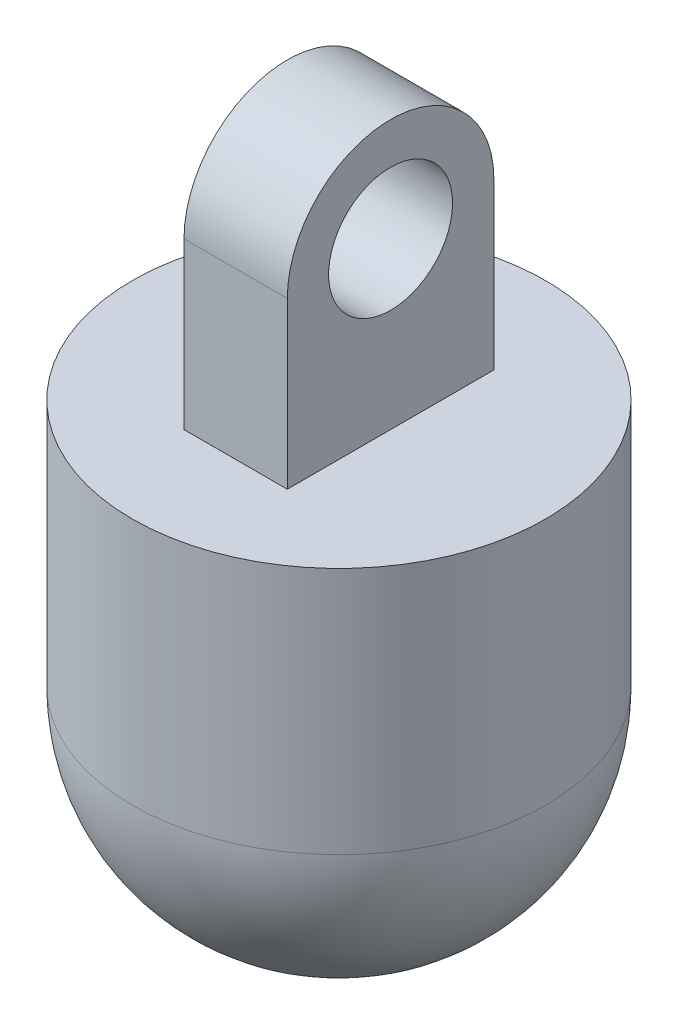
ISO-10303-21;
HEADER;
FILE_DESCRIPTION(('STEP AP214'),'2;1');
FILE_NAME('part.step','',(''),(''),'','','');
FILE_SCHEMA(('AUTOMOTIVE_DESIGN { 1 0 10303 214 1 1 1 1 }'));
ENDSEC;
DATA;
#1=APPLICATION_CONTEXT('core data for automotive mechanical design processes');
#2=APPLICATION_PROTOCOL_DEFINITION('international standard','automotive_design',2000,#1);
#3=PRODUCT_CONTEXT('',#1,'mechanical');
#4=PRODUCT('Part','Part','',(#3));
#5=PRODUCT_RELATED_PRODUCT_CATEGORY('part','',(#4));
#6=PRODUCT_DEFINITION_FORMATION('','',#4);
#7=PRODUCT_DEFINITION_CONTEXT('part definition',#1,'design');
#8=PRODUCT_DEFINITION('design','',#6,#7);
#9=PRODUCT_DEFINITION_SHAPE('','',#8);
#10=(LENGTH_UNIT() NAMED_UNIT(*) SI_UNIT(.MILLI.,.METRE.));
#11=(NAMED_UNIT(*) PLANE_ANGLE_UNIT() SI_UNIT($,.RADIAN.));
#12=(NAMED_UNIT(*) SI_UNIT($,.STERADIAN.) SOLID_ANGLE_UNIT());
#13=UNCERTAINTY_MEASURE_WITH_UNIT(LENGTH_MEASURE(1.E-05),#10,'distance_accuracy_value','');
#14=(GEOMETRIC_REPRESENTATION_CONTEXT(3) GLOBAL_UNCERTAINTY_ASSIGNED_CONTEXT((#13)) GLOBAL_UNIT_ASSIGNED_CONTEXT((#10,
#11,#12)) REPRESENTATION_CONTEXT('',''));
#15=CARTESIAN_POINT('',(0.,0.,0.));
#16=DIRECTION('',(0.,0.,1.));
#17=DIRECTION('',(1.,0.,0.));
#18=AXIS2_PLACEMENT_3D('',#15,#16,#17);
#19=CARTESIAN_POINT('',(0.,60.,0.));
#20=DIRECTION('',(0.,1.,0.));
#21=DIRECTION('',(0.,0.,1.));
#22=AXIS2_PLACEMENT_3D('',#19,#20,#21);
#23=PLANE('',#22);
#24=CARTESIAN_POINT('',(0.,60.,0.));
#25=DIRECTION('',(0.,1.,0.));
#26=DIRECTION('',(0.,0.,1.));
#27=AXIS2_PLACEMENT_3D('',#24,#25,#26);
#28=CIRCLE('',#27,50.);
#29=CARTESIAN_POINT('',(0.,60.,50.));
#30=VERTEX_POINT('',#29);
#31=EDGE_CURVE('E11',#30,#30,#28,.T.);
#32=ORIENTED_EDGE('',*,*,#31,.T.);
#33=EDGE_LOOP('',(#32));
#34=FACE_BOUND('',#33,.T.);
#35=DIRECTION('',(0.,0.,-1.));
#36=VECTOR('',#35,1.);
#37=CARTESIAN_POINT('',(12.5,60.,25.));
#38=LINE('',#37,#36);
#39=CARTESIAN_POINT('',(12.5,60.,25.));
#40=VERTEX_POINT('',#39);
#41=CARTESIAN_POINT('',(12.5,60.,-25.));
#42=VERTEX_POINT('',#41);
#43=EDGE_CURVE('E85',#40,#42,#38,.T.);
#44=ORIENTED_EDGE('',*,*,#43,.F.);
#45=DIRECTION('',(-1.,0.,0.));
#46=VECTOR('',#45,1.);
#47=CARTESIAN_POINT('',(12.5,60.,25.));
#48=LINE('',#47,#46);
#49=CARTESIAN_POINT('',(-12.5,60.,25.));
#50=VERTEX_POINT('',#49);
#51=EDGE_CURVE('E83',#40,#50,#48,.T.);
#52=ORIENTED_EDGE('',*,*,#51,.T.);
#53=DIRECTION('',(0.,0.,-1.));
#54=VECTOR('',#53,1.);
#55=CARTESIAN_POINT('',(-12.5,60.,25.));
#56=LINE('',#55,#54);
#57=CARTESIAN_POINT('',(-12.5,60.,-25.));
#58=VERTEX_POINT('',#57);
#59=EDGE_CURVE('E105',#50,#58,#56,.T.);
#60=ORIENTED_EDGE('',*,*,#59,.T.);
#61=DIRECTION('',(-1.,0.,0.));
#62=VECTOR('',#61,1.);
#63=CARTESIAN_POINT('',(12.5,60.,-25.));
#64=LINE('',#63,#62);
#65=EDGE_CURVE('E98',#42,#58,#64,.T.);
#66=ORIENTED_EDGE('',*,*,#65,.F.);
#67=EDGE_LOOP('',(#44,#52,#60,#66));
#68=FACE_BOUND('',#67,.T.);
#69=ADVANCED_FACE('F35',(#34,#68),#23,.T.);
#70=CARTESIAN_POINT('',(0.,60.,0.));
#71=DIRECTION('',(0.,-1.,0.));
#72=DIRECTION('',(0.,0.,-1.));
#73=AXIS2_PLACEMENT_3D('',#70,#71,#72);
#74=CYLINDRICAL_SURFACE('',#73,50.);
#75=ORIENTED_EDGE('',*,*,#31,.F.);
#76=EDGE_LOOP('',(#75));
#77=FACE_BOUND('',#76,.T.);
#78=CARTESIAN_POINT('',(0.,0.,0.));
#79=DIRECTION('',(0.,1.,0.));
#80=DIRECTION('',(0.,0.,1.));
#81=AXIS2_PLACEMENT_3D('',#78,#79,#80);
#82=CIRCLE('',#81,50.);
#83=CARTESIAN_POINT('',(0.,0.,50.));
#84=VERTEX_POINT('',#83);
#85=EDGE_CURVE('E39',#84,#84,#82,.T.);
#86=ORIENTED_EDGE('',*,*,#85,.T.);
#87=EDGE_LOOP('',(#86));
#88=FACE_BOUND('',#87,.T.);
#89=ADVANCED_FACE('F131',(#77,#88),#74,.T.);
#90=CARTESIAN_POINT('',(0.,0.,0.));
#91=DIRECTION('',(0.,0.,1.));
#92=DIRECTION('',(1.,0.,0.));
#93=AXIS2_PLACEMENT_3D('',#90,#91,#92);
#94=SPHERICAL_SURFACE('',#93,50.);
#95=CARTESIAN_POINT('',(0.,0.,0.));
#96=DIRECTION('',(0.,1.,0.));
#97=DIRECTION('',(0.,0.,1.));
#98=AXIS2_PLACEMENT_3D('',#95,#96,#97);
#99=SPHERICAL_SURFACE('',#98,50.);
#100=ORIENTED_EDGE('',*,*,#85,.F.);
#101=EDGE_LOOP('',(#100));
#102=FACE_BOUND('',#101,.T.);
#103=ADVANCED_FACE('F37',(#102),#99,.T.);
#104=CARTESIAN_POINT('',(12.5,100.,0.));
#105=DIRECTION('',(1.,0.,0.));
#106=DIRECTION('',(0.,0.,-1.));
#107=AXIS2_PLACEMENT_3D('',#104,#105,#106);
#108=PLANE('',#107);
#109=CARTESIAN_POINT('',(12.5,100.,0.));
#110=DIRECTION('',(1.,0.,0.));
#111=DIRECTION('',(0.,0.,-1.));
#112=AXIS2_PLACEMENT_3D('',#109,#110,#111);
#113=CIRCLE('',#112,25.);
#114=CARTESIAN_POINT('',(12.5,100.,-25.));
#115=VERTEX_POINT('',#114);
#116=CARTESIAN_POINT('',(12.5,100.,25.));
#117=VERTEX_POINT('',#116);
#118=EDGE_CURVE('E86',#115,#117,#113,.T.);
#119=ORIENTED_EDGE('',*,*,#118,.T.);
#120=DIRECTION('',(0.,-1.,0.));
#121=VECTOR('',#120,1.);
#122=CARTESIAN_POINT('',(12.5,100.,25.));
#123=LINE('',#122,#121);
#124=EDGE_CURVE('E77',#117,#40,#123,.T.);
#125=ORIENTED_EDGE('',*,*,#124,.T.);
#126=ORIENTED_EDGE('',*,*,#43,.T.);
#127=DIRECTION('',(0.,1.,0.));
#128=VECTOR('',#127,1.);
#129=CARTESIAN_POINT('',(12.5,60.,-25.));
#130=LINE('',#129,#128);
#131=EDGE_CURVE('E50',#42,#115,#130,.T.);
#132=ORIENTED_EDGE('',*,*,#131,.T.);
#133=EDGE_LOOP('',(#119,#125,#126,#132));
#134=FACE_BOUND('',#133,.T.);
#135=CARTESIAN_POINT('',(12.5,100.,0.));
#136=DIRECTION('',(1.,0.,0.));
#137=DIRECTION('',(0.,0.,-1.));
#138=AXIS2_PLACEMENT_3D('',#135,#136,#137);
#139=CIRCLE('',#138,15.);
#140=CARTESIAN_POINT('',(12.5,100.,-15.));
#141=VERTEX_POINT('',#140);
#142=EDGE_CURVE('E111',#141,#141,#139,.T.);
#143=ORIENTED_EDGE('',*,*,#142,.F.);
#144=EDGE_LOOP('',(#143));
#145=FACE_BOUND('',#144,.T.);
#146=ADVANCED_FACE('F89',(#134,#145),#108,.T.);
#147=CARTESIAN_POINT('',(-12.5,100.,0.));
#148=DIRECTION('',(1.,0.,0.));
#149=DIRECTION('',(0.,0.,-1.));
#150=AXIS2_PLACEMENT_3D('',#147,#148,#149);
#151=PLANE('',#150);
#152=CARTESIAN_POINT('',(-12.5,100.,0.));
#153=DIRECTION('',(1.,0.,0.));
#154=DIRECTION('',(0.,0.,-1.));
#155=AXIS2_PLACEMENT_3D('',#152,#153,#154);
#156=CIRCLE('',#155,25.);
#157=CARTESIAN_POINT('',(-12.5,100.,-25.));
#158=VERTEX_POINT('',#157);
#159=CARTESIAN_POINT('',(-12.5,100.,25.));
#160=VERTEX_POINT('',#159);
#161=EDGE_CURVE('E95',#158,#160,#156,.T.);
#162=ORIENTED_EDGE('',*,*,#161,.F.);
#163=DIRECTION('',(0.,1.,0.));
#164=VECTOR('',#163,1.);
#165=CARTESIAN_POINT('',(-12.5,60.,-25.));
#166=LINE('',#165,#164);
#167=EDGE_CURVE('E71',#58,#158,#166,.T.);
#168=ORIENTED_EDGE('',*,*,#167,.F.);
#169=ORIENTED_EDGE('',*,*,#59,.F.);
#170=DIRECTION('',(0.,-1.,0.));
#171=VECTOR('',#170,1.);
#172=CARTESIAN_POINT('',(-12.5,100.,25.));
#173=LINE('',#172,#171);
#174=EDGE_CURVE('E108',#160,#50,#173,.T.);
#175=ORIENTED_EDGE('',*,*,#174,.F.);
#176=EDGE_LOOP('',(#162,#168,#169,#175));
#177=FACE_BOUND('',#176,.T.);
#178=CARTESIAN_POINT('',(-12.5,100.,0.));
#179=DIRECTION('',(1.,0.,0.));
#180=DIRECTION('',(0.,0.,-1.));
#181=AXIS2_PLACEMENT_3D('',#178,#179,#180);
#182=CIRCLE('',#181,15.);
#183=CARTESIAN_POINT('',(-12.5,100.,-15.));
#184=VERTEX_POINT('',#183);
#185=EDGE_CURVE('E114',#184,#184,#182,.T.);
#186=ORIENTED_EDGE('',*,*,#185,.T.);
#187=EDGE_LOOP('',(#186));
#188=FACE_BOUND('',#187,.T.);
#189=ADVANCED_FACE('F123',(#177,#188),#151,.F.);
#190=CARTESIAN_POINT('',(12.5,100.,0.));
#191=DIRECTION('',(-1.,0.,0.));
#192=DIRECTION('',(0.,0.,1.));
#193=AXIS2_PLACEMENT_3D('',#190,#191,#192);
#194=CYLINDRICAL_SURFACE('',#193,25.);
#195=ORIENTED_EDGE('',*,*,#161,.T.);
#196=DIRECTION('',(-1.,0.,0.));
#197=VECTOR('',#196,1.);
#198=CARTESIAN_POINT('',(12.5,100.,25.));
#199=LINE('',#198,#197);
#200=EDGE_CURVE('E80',#117,#160,#199,.T.);
#201=ORIENTED_EDGE('',*,*,#200,.F.);
#202=ORIENTED_EDGE('',*,*,#118,.F.);
#203=DIRECTION('',(-1.,0.,0.));
#204=VECTOR('',#203,1.);
#205=CARTESIAN_POINT('',(12.5,100.,-25.));
#206=LINE('',#205,#204);
#207=EDGE_CURVE('E102',#115,#158,#206,.T.);
#208=ORIENTED_EDGE('',*,*,#207,.T.);
#209=EDGE_LOOP('',(#195,#201,#202,#208));
#210=FACE_BOUND('',#209,.T.);
#211=ADVANCED_FACE('F93',(#210),#194,.T.);
#212=CARTESIAN_POINT('',(12.5,100.,25.));
#213=DIRECTION('',(0.,0.,-1.));
#214=DIRECTION('',(0.,1.,0.));
#215=AXIS2_PLACEMENT_3D('',#212,#213,#214);
#216=PLANE('',#215);
#217=ORIENTED_EDGE('',*,*,#174,.T.);
#218=ORIENTED_EDGE('',*,*,#51,.F.);
#219=ORIENTED_EDGE('',*,*,#124,.F.);
#220=ORIENTED_EDGE('',*,*,#200,.T.);
#221=EDGE_LOOP('',(#217,#218,#219,#220));
#222=FACE_BOUND('',#221,.T.);
#223=ADVANCED_FACE('F78',(#222),#216,.F.);
#224=CARTESIAN_POINT('',(12.5,60.,-25.));
#225=DIRECTION('',(0.,0.,1.));
#226=DIRECTION('',(0.,-1.,0.));
#227=AXIS2_PLACEMENT_3D('',#224,#225,#226);
#228=PLANE('',#227);
#229=ORIENTED_EDGE('',*,*,#167,.T.);
#230=ORIENTED_EDGE('',*,*,#207,.F.);
#231=ORIENTED_EDGE('',*,*,#131,.F.);
#232=ORIENTED_EDGE('',*,*,#65,.T.);
#233=EDGE_LOOP('',(#229,#230,#231,#232));
#234=FACE_BOUND('',#233,.T.);
#235=ADVANCED_FACE('F147',(#234),#228,.F.);
#236=CARTESIAN_POINT('',(12.5,100.,0.));
#237=DIRECTION('',(-1.,0.,0.));
#238=DIRECTION('',(0.,0.,1.));
#239=AXIS2_PLACEMENT_3D('',#236,#237,#238);
#240=CYLINDRICAL_SURFACE('',#239,15.);
#241=ORIENTED_EDGE('',*,*,#142,.T.);
#242=EDGE_LOOP('',(#241));
#243=FACE_BOUND('',#242,.T.);
#244=ORIENTED_EDGE('',*,*,#185,.F.);
#245=EDGE_LOOP('',(#244));
#246=FACE_BOUND('',#245,.T.);
#247=ADVANCED_FACE('F120',(#243,#246),#240,.F.);
#248=CLOSED_SHELL('',(#69,#89,#103,#146,#189,#211,#223,#235,#247));
#249=MANIFOLD_SOLID_BREP('B2',#248);
#250=ADVANCED_BREP_SHAPE_REPRESENTATION('',(#18,#249),#14);
#251=SHAPE_DEFINITION_REPRESENTATION(#9,#250);
ENDSEC;
END-ISO-10303-21;
